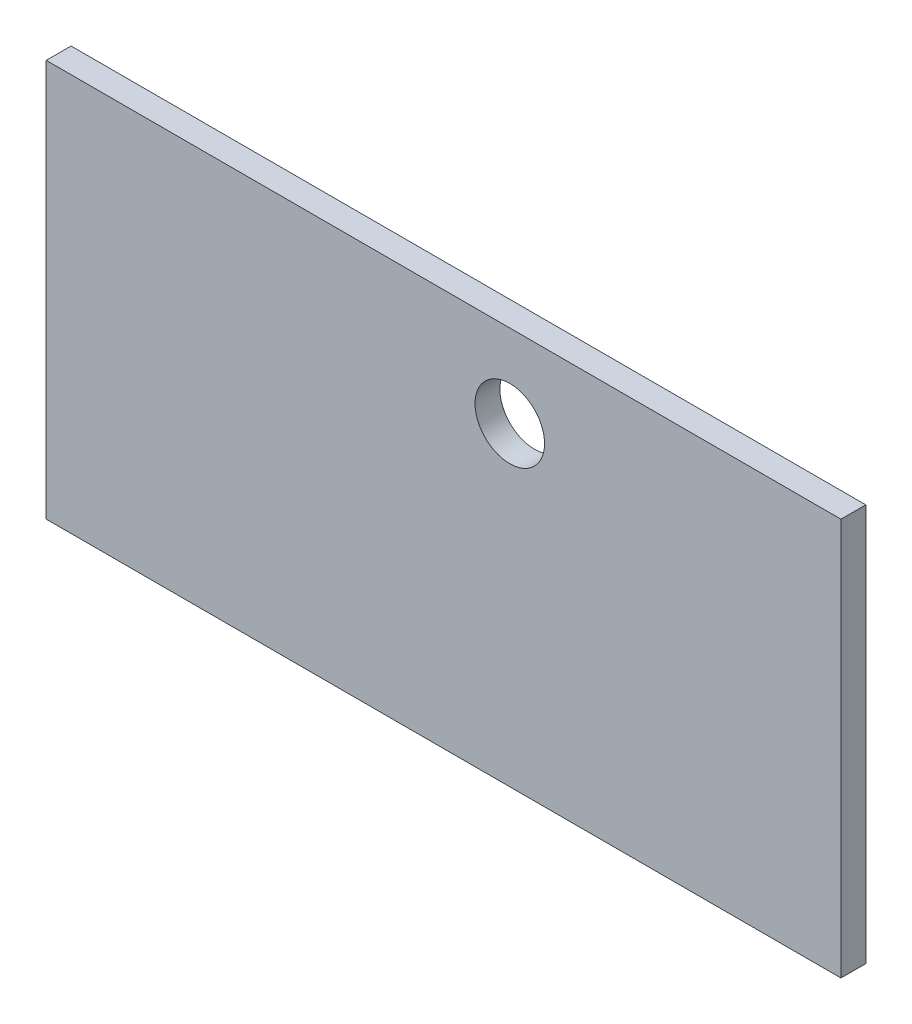
ISO-10303-21;
HEADER;
FILE_DESCRIPTION(('STEP AP214'),'2;1');
FILE_NAME('part.step','',(''),(''),'','','');
FILE_SCHEMA(('AUTOMOTIVE_DESIGN { 1 0 10303 214 1 1 1 1 }'));
ENDSEC;
DATA;
#1=APPLICATION_CONTEXT('core data for automotive mechanical design processes');
#2=APPLICATION_PROTOCOL_DEFINITION('international standard','automotive_design',2000,#1);
#3=PRODUCT_CONTEXT('',#1,'mechanical');
#4=PRODUCT('Part','Part','',(#3));
#5=PRODUCT_RELATED_PRODUCT_CATEGORY('part','',(#4));
#6=PRODUCT_DEFINITION_FORMATION('','',#4);
#7=PRODUCT_DEFINITION_CONTEXT('part definition',#1,'design');
#8=PRODUCT_DEFINITION('design','',#6,#7);
#9=PRODUCT_DEFINITION_SHAPE('','',#8);
#10=(LENGTH_UNIT() NAMED_UNIT(*) SI_UNIT(.MILLI.,.METRE.));
#11=(NAMED_UNIT(*) PLANE_ANGLE_UNIT() SI_UNIT($,.RADIAN.));
#12=(NAMED_UNIT(*) SI_UNIT($,.STERADIAN.) SOLID_ANGLE_UNIT());
#13=UNCERTAINTY_MEASURE_WITH_UNIT(LENGTH_MEASURE(1.E-05),#10,'distance_accuracy_value','');
#14=(GEOMETRIC_REPRESENTATION_CONTEXT(3) GLOBAL_UNCERTAINTY_ASSIGNED_CONTEXT((#13)) GLOBAL_UNIT_ASSIGNED_CONTEXT((#10,
#11,#12)) REPRESENTATION_CONTEXT('',''));
#15=CARTESIAN_POINT('',(0.,0.,0.));
#16=DIRECTION('',(0.,0.,1.));
#17=DIRECTION('',(1.,0.,0.));
#18=AXIS2_PLACEMENT_3D('',#15,#16,#17);
#19=CARTESIAN_POINT('',(152.4,-76.2,9.525));
#20=DIRECTION('',(-1.,0.,0.));
#21=DIRECTION('',(0.,0.,1.));
#22=AXIS2_PLACEMENT_3D('',#19,#20,#21);
#23=PLANE('',#22);
#24=DIRECTION('',(0.,1.,0.));
#25=VECTOR('',#24,1.);
#26=CARTESIAN_POINT('',(152.4,-76.2,0.));
#27=LINE('',#26,#25);
#28=CARTESIAN_POINT('',(152.4,-76.2,0.));
#29=VERTEX_POINT('',#28);
#30=CARTESIAN_POINT('',(152.4,76.2,0.));
#31=VERTEX_POINT('',#30);
#32=EDGE_CURVE('E98',#29,#31,#27,.T.);
#33=ORIENTED_EDGE('',*,*,#32,.T.);
#34=DIRECTION('',(0.,0.,-1.));
#35=VECTOR('',#34,1.);
#36=CARTESIAN_POINT('',(152.4,76.2,9.525));
#37=LINE('',#36,#35);
#38=CARTESIAN_POINT('',(152.4,76.2,9.525));
#39=VERTEX_POINT('',#38);
#40=EDGE_CURVE('E11',#39,#31,#37,.T.);
#41=ORIENTED_EDGE('',*,*,#40,.F.);
#42=DIRECTION('',(0.,1.,0.));
#43=VECTOR('',#42,1.);
#44=CARTESIAN_POINT('',(152.4,-76.2,9.525));
#45=LINE('',#44,#43);
#46=CARTESIAN_POINT('',(152.4,-76.2,9.525));
#47=VERTEX_POINT('',#46);
#48=EDGE_CURVE('E86',#47,#39,#45,.T.);
#49=ORIENTED_EDGE('',*,*,#48,.F.);
#50=DIRECTION('',(0.,0.,-1.));
#51=VECTOR('',#50,1.);
#52=CARTESIAN_POINT('',(152.4,-76.2,9.525));
#53=LINE('',#52,#51);
#54=EDGE_CURVE('E94',#47,#29,#53,.T.);
#55=ORIENTED_EDGE('',*,*,#54,.T.);
#56=EDGE_LOOP('',(#33,#41,#49,#55));
#57=FACE_BOUND('',#56,.T.);
#58=ADVANCED_FACE('F35',(#57),#23,.F.);
#59=CARTESIAN_POINT('',(-152.4,76.2,9.525));
#60=DIRECTION('',(0.,-1.,0.));
#61=DIRECTION('',(0.,0.,-1.));
#62=AXIS2_PLACEMENT_3D('',#59,#60,#61);
#63=PLANE('',#62);
#64=DIRECTION('',(-1.,0.,0.));
#65=VECTOR('',#64,1.);
#66=CARTESIAN_POINT('',(-152.4,76.2,0.));
#67=LINE('',#66,#65);
#68=CARTESIAN_POINT('',(-152.4,76.2,0.));
#69=VERTEX_POINT('',#68);
#70=EDGE_CURVE('E90',#31,#69,#67,.T.);
#71=ORIENTED_EDGE('',*,*,#70,.T.);
#72=DIRECTION('',(0.,0.,-1.));
#73=VECTOR('',#72,1.);
#74=CARTESIAN_POINT('',(-152.4,76.2,9.525));
#75=LINE('',#74,#73);
#76=CARTESIAN_POINT('',(-152.4,76.2,9.525));
#77=VERTEX_POINT('',#76);
#78=EDGE_CURVE('E43',#77,#69,#75,.T.);
#79=ORIENTED_EDGE('',*,*,#78,.F.);
#80=DIRECTION('',(-1.,0.,0.));
#81=VECTOR('',#80,1.);
#82=CARTESIAN_POINT('',(-152.4,76.2,9.525));
#83=LINE('',#82,#81);
#84=EDGE_CURVE('E81',#39,#77,#83,.T.);
#85=ORIENTED_EDGE('',*,*,#84,.F.);
#86=ORIENTED_EDGE('',*,*,#40,.T.);
#87=EDGE_LOOP('',(#71,#79,#85,#86));
#88=FACE_BOUND('',#87,.T.);
#89=ADVANCED_FACE('F89',(#88),#63,.F.);
#90=CARTESIAN_POINT('',(-152.4,-76.2,9.525));
#91=DIRECTION('',(1.,0.,0.));
#92=DIRECTION('',(0.,0.,-1.));
#93=AXIS2_PLACEMENT_3D('',#90,#91,#92);
#94=PLANE('',#93);
#95=DIRECTION('',(0.,-1.,0.));
#96=VECTOR('',#95,1.);
#97=CARTESIAN_POINT('',(-152.4,-76.2,0.));
#98=LINE('',#97,#96);
#99=CARTESIAN_POINT('',(-152.4,-76.2,0.));
#100=VERTEX_POINT('',#99);
#101=EDGE_CURVE('E68',#69,#100,#98,.T.);
#102=ORIENTED_EDGE('',*,*,#101,.T.);
#103=DIRECTION('',(0.,0.,-1.));
#104=VECTOR('',#103,1.);
#105=CARTESIAN_POINT('',(-152.4,-76.2,9.525));
#106=LINE('',#105,#104);
#107=CARTESIAN_POINT('',(-152.4,-76.2,9.525));
#108=VERTEX_POINT('',#107);
#109=EDGE_CURVE('E91',#108,#100,#106,.T.);
#110=ORIENTED_EDGE('',*,*,#109,.F.);
#111=DIRECTION('',(0.,-1.,0.));
#112=VECTOR('',#111,1.);
#113=CARTESIAN_POINT('',(-152.4,-76.2,9.525));
#114=LINE('',#113,#112);
#115=EDGE_CURVE('E84',#77,#108,#114,.T.);
#116=ORIENTED_EDGE('',*,*,#115,.F.);
#117=ORIENTED_EDGE('',*,*,#78,.T.);
#118=EDGE_LOOP('',(#102,#110,#116,#117));
#119=FACE_BOUND('',#118,.T.);
#120=ADVANCED_FACE('F92',(#119),#94,.F.);
#121=CARTESIAN_POINT('',(-152.4,-76.2,9.525));
#122=DIRECTION('',(0.,1.,0.));
#123=DIRECTION('',(0.,0.,1.));
#124=AXIS2_PLACEMENT_3D('',#121,#122,#123);
#125=PLANE('',#124);
#126=DIRECTION('',(1.,0.,0.));
#127=VECTOR('',#126,1.);
#128=CARTESIAN_POINT('',(-152.4,-76.2,0.));
#129=LINE('',#128,#127);
#130=EDGE_CURVE('E74',#100,#29,#129,.T.);
#131=ORIENTED_EDGE('',*,*,#130,.T.);
#132=ORIENTED_EDGE('',*,*,#54,.F.);
#133=DIRECTION('',(1.,0.,0.));
#134=VECTOR('',#133,1.);
#135=CARTESIAN_POINT('',(-152.4,-76.2,9.525));
#136=LINE('',#135,#134);
#137=EDGE_CURVE('E51',#108,#47,#136,.T.);
#138=ORIENTED_EDGE('',*,*,#137,.F.);
#139=ORIENTED_EDGE('',*,*,#109,.T.);
#140=EDGE_LOOP('',(#131,#132,#138,#139));
#141=FACE_BOUND('',#140,.T.);
#142=ADVANCED_FACE('F106',(#141),#125,.F.);
#143=CARTESIAN_POINT('',(0.,0.,9.525));
#144=DIRECTION('',(0.,0.,-1.));
#145=DIRECTION('',(-1.,0.,0.));
#146=AXIS2_PLACEMENT_3D('',#143,#144,#145);
#147=PLANE('',#146);
#148=CARTESIAN_POINT('',(25.4,44.45,9.525));
#149=DIRECTION('',(0.,0.,-1.));
#150=DIRECTION('',(-1.,0.,0.));
#151=AXIS2_PLACEMENT_3D('',#148,#149,#150);
#152=CIRCLE('',#151,13.335);
#153=CARTESIAN_POINT('',(12.065,44.45,9.525));
#154=VERTEX_POINT('',#153);
#155=EDGE_CURVE('E101',#154,#154,#152,.T.);
#156=ORIENTED_EDGE('',*,*,#155,.T.);
#157=EDGE_LOOP('',(#156));
#158=FACE_BOUND('',#157,.T.);
#159=ORIENTED_EDGE('',*,*,#48,.T.);
#160=ORIENTED_EDGE('',*,*,#84,.T.);
#161=ORIENTED_EDGE('',*,*,#115,.T.);
#162=ORIENTED_EDGE('',*,*,#137,.T.);
#163=EDGE_LOOP('',(#159,#160,#161,#162));
#164=FACE_BOUND('',#163,.T.);
#165=ADVANCED_FACE('F82',(#158,#164),#147,.F.);
#166=CARTESIAN_POINT('',(0.,0.,0.));
#167=DIRECTION('',(0.,0.,-1.));
#168=DIRECTION('',(-1.,0.,0.));
#169=AXIS2_PLACEMENT_3D('',#166,#167,#168);
#170=PLANE('',#169);
#171=CARTESIAN_POINT('',(25.4,44.45,0.));
#172=DIRECTION('',(0.,0.,-1.));
#173=DIRECTION('',(-1.,0.,0.));
#174=AXIS2_PLACEMENT_3D('',#171,#172,#173);
#175=CIRCLE('',#174,13.335);
#176=CARTESIAN_POINT('',(12.065,44.45,0.));
#177=VERTEX_POINT('',#176);
#178=EDGE_CURVE('E112',#177,#177,#175,.T.);
#179=ORIENTED_EDGE('',*,*,#178,.F.);
#180=EDGE_LOOP('',(#179));
#181=FACE_BOUND('',#180,.T.);
#182=ORIENTED_EDGE('',*,*,#32,.F.);
#183=ORIENTED_EDGE('',*,*,#130,.F.);
#184=ORIENTED_EDGE('',*,*,#101,.F.);
#185=ORIENTED_EDGE('',*,*,#70,.F.);
#186=EDGE_LOOP('',(#182,#183,#184,#185));
#187=FACE_BOUND('',#186,.T.);
#188=ADVANCED_FACE('F109',(#181,#187),#170,.T.);
#189=CARTESIAN_POINT('',(25.4,44.45,9.525));
#190=DIRECTION('',(0.,0.,-1.));
#191=DIRECTION('',(-1.,0.,0.));
#192=AXIS2_PLACEMENT_3D('',#189,#190,#191);
#193=CYLINDRICAL_SURFACE('',#192,13.335);
#194=CARTESIAN_POINT('',(12.065,44.45,9.525));
#195=CARTESIAN_POINT('',(12.065,44.45,9.42578125));
#196=CARTESIAN_POINT('',(12.065,44.45,9.3265625));
#197=CARTESIAN_POINT('',(12.065,44.45,9.128125));
#198=CARTESIAN_POINT('',(12.065,44.45,9.02890625));
#199=CARTESIAN_POINT('',(12.065,44.45,8.83046875));
#200=CARTESIAN_POINT('',(12.065,44.45,8.73125));
#201=CARTESIAN_POINT('',(12.065,44.45,8.5328125));
#202=CARTESIAN_POINT('',(12.065,44.45,8.43359375));
#203=CARTESIAN_POINT('',(12.065,44.45,8.23515625));
#204=CARTESIAN_POINT('',(12.065,44.45,8.1359375));
#205=CARTESIAN_POINT('',(12.065,44.45,7.9375));
#206=CARTESIAN_POINT('',(12.065,44.45,7.83828125));
#207=CARTESIAN_POINT('',(12.065,44.45,7.63984375));
#208=CARTESIAN_POINT('',(12.065,44.45,7.540625));
#209=CARTESIAN_POINT('',(12.065,44.45,7.3421875));
#210=CARTESIAN_POINT('',(12.065,44.45,7.24296875));
#211=CARTESIAN_POINT('',(12.065,44.45,7.04453125));
#212=CARTESIAN_POINT('',(12.065,44.45,6.9453125));
#213=CARTESIAN_POINT('',(12.065,44.45,6.746875));
#214=CARTESIAN_POINT('',(12.065,44.45,6.64765625));
#215=CARTESIAN_POINT('',(12.065,44.45,6.44921875));
#216=CARTESIAN_POINT('',(12.065,44.45,6.35));
#217=CARTESIAN_POINT('',(12.065,44.45,6.1515625));
#218=CARTESIAN_POINT('',(12.065,44.45,6.05234375));
#219=CARTESIAN_POINT('',(12.065,44.45,5.85390625));
#220=CARTESIAN_POINT('',(12.065,44.45,5.7546875));
#221=CARTESIAN_POINT('',(12.065,44.45,5.55625));
#222=CARTESIAN_POINT('',(12.065,44.45,5.45703125));
#223=CARTESIAN_POINT('',(12.065,44.45,5.25859375));
#224=CARTESIAN_POINT('',(12.065,44.45,5.159375));
#225=CARTESIAN_POINT('',(12.065,44.45,4.9609375));
#226=CARTESIAN_POINT('',(12.065,44.45,4.86171875));
#227=CARTESIAN_POINT('',(12.065,44.45,4.66328125));
#228=CARTESIAN_POINT('',(12.065,44.45,4.5640625));
#229=CARTESIAN_POINT('',(12.065,44.45,4.365625));
#230=CARTESIAN_POINT('',(12.065,44.45,4.26640625));
#231=CARTESIAN_POINT('',(12.065,44.45,4.06796875));
#232=CARTESIAN_POINT('',(12.065,44.45,3.96875));
#233=CARTESIAN_POINT('',(12.065,44.45,3.7703125));
#234=CARTESIAN_POINT('',(12.065,44.45,3.67109375));
#235=CARTESIAN_POINT('',(12.065,44.45,3.47265625));
#236=CARTESIAN_POINT('',(12.065,44.45,3.3734375));
#237=CARTESIAN_POINT('',(12.065,44.45,3.175));
#238=CARTESIAN_POINT('',(12.065,44.45,3.07578125));
#239=CARTESIAN_POINT('',(12.065,44.45,2.87734375));
#240=CARTESIAN_POINT('',(12.065,44.45,2.778125));
#241=CARTESIAN_POINT('',(12.065,44.45,2.5796875));
#242=CARTESIAN_POINT('',(12.065,44.45,2.48046875));
#243=CARTESIAN_POINT('',(12.065,44.45,2.28203125));
#244=CARTESIAN_POINT('',(12.065,44.45,2.1828125));
#245=CARTESIAN_POINT('',(12.065,44.45,1.984375));
#246=CARTESIAN_POINT('',(12.065,44.45,1.88515625));
#247=CARTESIAN_POINT('',(12.065,44.45,1.68671875));
#248=CARTESIAN_POINT('',(12.065,44.45,1.5875));
#249=CARTESIAN_POINT('',(12.065,44.45,1.3890625));
#250=CARTESIAN_POINT('',(12.065,44.45,1.28984375));
#251=CARTESIAN_POINT('',(12.065,44.45,1.09140625));
#252=CARTESIAN_POINT('',(12.065,44.45,0.992187500000001));
#253=CARTESIAN_POINT('',(12.065,44.45,0.793750000000001));
#254=CARTESIAN_POINT('',(12.065,44.45,0.69453125));
#255=CARTESIAN_POINT('',(12.065,44.45,0.49609375));
#256=CARTESIAN_POINT('',(12.065,44.45,0.396875));
#257=CARTESIAN_POINT('',(12.065,44.45,0.1984375));
#258=CARTESIAN_POINT('',(12.065,44.45,0.0992187500000001));
#259=CARTESIAN_POINT('',(12.065,44.45,0.));
#260=B_SPLINE_CURVE_WITH_KNOTS('',3,(#194,#195,#196,#197,#198,#199,#200,#201,#202,#203,#204,
#205,#206,#207,#208,#209,#210,#211,#212,#213,#214,#215,#216,#217,#218,#219,#220,#221,#222,#223,
#224,#225,#226,#227,#228,#229,#230,#231,#232,#233,#234,#235,#236,#237,#238,#239,#240,#241,#242,
#243,#244,#245,#246,#247,#248,#249,#250,#251,#252,#253,#254,#255,#256,#257,#258,#259),
.UNSPECIFIED.,.F.,.F.,(4,2,2,2,2,2,2,2,2,2,2,2,2,2,2,2,2,2,2,2,2,2,2,2,2,2,2,2,2,2,2,2,4),(0.,
0.29765625,0.5953125,0.892968750000001,1.190625,1.48828125,1.7859375,2.08359375,2.38125,
2.67890625,2.9765625,3.27421875,3.571875,3.86953125,4.1671875,4.46484375,4.7625,5.06015625,
5.3578125,5.65546875,5.953125,6.25078125,6.5484375,6.84609375,7.14375,7.44140625,7.7390625,
8.03671875,8.334375,8.63203125,8.9296875,9.22734375,9.525),.UNSPECIFIED.);
#261=EDGE_CURVE('BSEAM119',#154,#177,#260,.T.);
#262=ORIENTED_EDGE('',*,*,#155,.F.);
#263=ORIENTED_EDGE('',*,*,#178,.T.);
#264=ORIENTED_EDGE('',*,*,#261,.T.);
#265=ORIENTED_EDGE('',*,*,#261,.F.);
#266=EDGE_LOOP('',(#262,#264,#263,#265));
#267=FACE_BOUND('',#266,.T.);
#268=ADVANCED_FACE('F119',(#267),#193,.F.);
#269=CLOSED_SHELL('',(#58,#89,#120,#142,#165,#188,#268));
#270=MANIFOLD_SOLID_BREP('B2',#269);
#271=ADVANCED_BREP_SHAPE_REPRESENTATION('',(#18,#270),#14);
#272=SHAPE_DEFINITION_REPRESENTATION(#9,#271);
ENDSEC;
END-ISO-10303-21;
